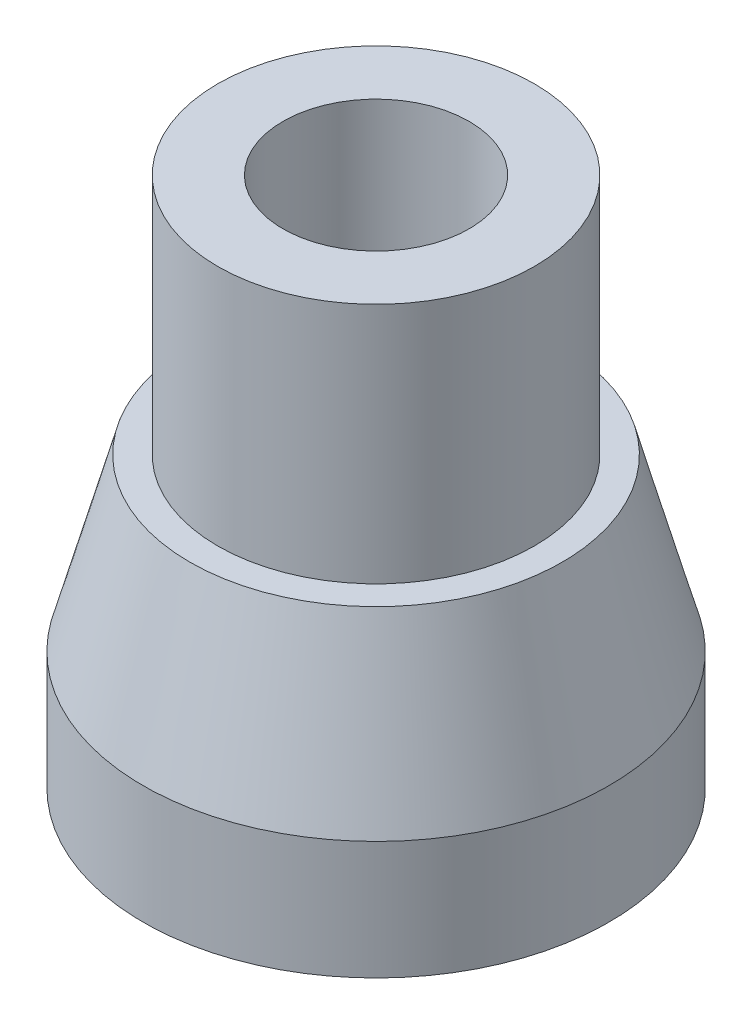
ISO-10303-21;
HEADER;
FILE_DESCRIPTION(('STEP AP214'),'2;1');
FILE_NAME('part.step','',(''),(''),'','','');
FILE_SCHEMA(('AUTOMOTIVE_DESIGN { 1 0 10303 214 1 1 1 1 }'));
ENDSEC;
DATA;
#1=APPLICATION_CONTEXT('core data for automotive mechanical design processes');
#2=APPLICATION_PROTOCOL_DEFINITION('international standard','automotive_design',2000,#1);
#3=PRODUCT_CONTEXT('',#1,'mechanical');
#4=PRODUCT('Part','Part','',(#3));
#5=PRODUCT_RELATED_PRODUCT_CATEGORY('part','',(#4));
#6=PRODUCT_DEFINITION_FORMATION('','',#4);
#7=PRODUCT_DEFINITION_CONTEXT('part definition',#1,'design');
#8=PRODUCT_DEFINITION('design','',#6,#7);
#9=PRODUCT_DEFINITION_SHAPE('','',#8);
#10=(LENGTH_UNIT() NAMED_UNIT(*) SI_UNIT(.MILLI.,.METRE.));
#11=(NAMED_UNIT(*) PLANE_ANGLE_UNIT() SI_UNIT($,.RADIAN.));
#12=(NAMED_UNIT(*) SI_UNIT($,.STERADIAN.) SOLID_ANGLE_UNIT());
#13=UNCERTAINTY_MEASURE_WITH_UNIT(LENGTH_MEASURE(1.E-05),#10,'distance_accuracy_value','');
#14=(GEOMETRIC_REPRESENTATION_CONTEXT(3) GLOBAL_UNCERTAINTY_ASSIGNED_CONTEXT((#13)) GLOBAL_UNIT_ASSIGNED_CONTEXT((#10,
#11,#12)) REPRESENTATION_CONTEXT('',''));
#15=CARTESIAN_POINT('',(0.,0.,0.));
#16=DIRECTION('',(0.,0.,1.));
#17=DIRECTION('',(1.,0.,0.));
#18=AXIS2_PLACEMENT_3D('',#15,#16,#17);
#19=CARTESIAN_POINT('',(0.,0.,0.));
#20=DIRECTION('',(0.,-1.,0.));
#21=DIRECTION('',(0.,0.,-1.));
#22=AXIS2_PLACEMENT_3D('',#19,#20,#21);
#23=CYLINDRICAL_SURFACE('',#22,8.5);
#24=CARTESIAN_POINT('',(0.,28.5,0.));
#25=DIRECTION('',(0.,-1.,0.));
#26=DIRECTION('',(0.,0.,-1.));
#27=AXIS2_PLACEMENT_3D('',#24,#25,#26);
#28=CIRCLE('',#27,8.5);
#29=CARTESIAN_POINT('',(0.,28.5,-8.5));
#30=VERTEX_POINT('',#29);
#31=EDGE_CURVE('E10',#30,#30,#28,.T.);
#32=ORIENTED_EDGE('',*,*,#31,.T.);
#33=EDGE_LOOP('',(#32));
#34=FACE_BOUND('',#33,.T.);
#35=CARTESIAN_POINT('',(0.,15.5,0.));
#36=DIRECTION('',(0.,-1.,0.));
#37=DIRECTION('',(0.,0.,-1.));
#38=AXIS2_PLACEMENT_3D('',#35,#36,#37);
#39=CIRCLE('',#38,8.5);
#40=CARTESIAN_POINT('',(0.,15.5,-8.5));
#41=VERTEX_POINT('',#40);
#42=EDGE_CURVE('E78',#41,#41,#39,.T.);
#43=ORIENTED_EDGE('',*,*,#42,.F.);
#44=EDGE_LOOP('',(#43));
#45=FACE_BOUND('',#44,.T.);
#46=ADVANCED_FACE('F43',(#34,#45),#23,.T.);
#47=CARTESIAN_POINT('',(5.,28.5,0.));
#48=DIRECTION('',(0.,1.,0.));
#49=DIRECTION('',(0.,0.,1.));
#50=AXIS2_PLACEMENT_3D('',#47,#48,#49);
#51=PLANE('',#50);
#52=CARTESIAN_POINT('',(0.,28.5,0.));
#53=DIRECTION('',(0.,-1.,0.));
#54=DIRECTION('',(0.,0.,-1.));
#55=AXIS2_PLACEMENT_3D('',#52,#53,#54);
#56=CIRCLE('',#55,5.);
#57=CARTESIAN_POINT('',(0.,28.5,-5.));
#58=VERTEX_POINT('',#57);
#59=EDGE_CURVE('E50',#58,#58,#56,.T.);
#60=ORIENTED_EDGE('',*,*,#59,.T.);
#61=EDGE_LOOP('',(#60));
#62=FACE_BOUND('',#61,.T.);
#63=ORIENTED_EDGE('',*,*,#31,.F.);
#64=EDGE_LOOP('',(#63));
#65=FACE_BOUND('',#64,.T.);
#66=ADVANCED_FACE('F87',(#62,#65),#51,.T.);
#67=CARTESIAN_POINT('',(0.,0.,0.));
#68=DIRECTION('',(0.,-1.,0.));
#69=DIRECTION('',(0.,0.,-1.));
#70=AXIS2_PLACEMENT_3D('',#67,#68,#69);
#71=CYLINDRICAL_SURFACE('',#70,5.);
#72=CARTESIAN_POINT('',(0.,20.7216932059912,0.));
#73=DIRECTION('',(0.,-1.,0.));
#74=DIRECTION('',(0.,0.,-1.));
#75=AXIS2_PLACEMENT_3D('',#72,#73,#74);
#76=CIRCLE('',#75,5.);
#77=CARTESIAN_POINT('',(0.,20.7216932059912,-5.));
#78=VERTEX_POINT('',#77);
#79=EDGE_CURVE('E55',#78,#78,#76,.T.);
#80=ORIENTED_EDGE('',*,*,#79,.T.);
#81=EDGE_LOOP('',(#80));
#82=FACE_BOUND('',#81,.T.);
#83=ORIENTED_EDGE('',*,*,#59,.F.);
#84=EDGE_LOOP('',(#83));
#85=FACE_BOUND('',#84,.T.);
#86=ADVANCED_FACE('F91',(#82,#85),#71,.F.);
#87=CARTESIAN_POINT('',(0.,20.7216932059912,0.));
#88=DIRECTION('',(0.,-1.,0.));
#89=DIRECTION('',(0.,0.,-1.));
#90=AXIS2_PLACEMENT_3D('',#87,#88,#89);
#91=CONICAL_SURFACE('',#90,5.,0.266714369968657);
#92=CARTESIAN_POINT('',(0.,0.,0.));
#93=DIRECTION('',(0.,-1.,0.));
#94=DIRECTION('',(0.,0.,-1.));
#95=AXIS2_PLACEMENT_3D('',#92,#93,#94);
#96=CIRCLE('',#95,10.6616648103801);
#97=CARTESIAN_POINT('',(0.,0.,-10.6616648103801));
#98=VERTEX_POINT('',#97);
#99=EDGE_CURVE('E60',#98,#98,#96,.T.);
#100=ORIENTED_EDGE('',*,*,#99,.T.);
#101=EDGE_LOOP('',(#100));
#102=FACE_BOUND('',#101,.T.);
#103=ORIENTED_EDGE('',*,*,#79,.F.);
#104=EDGE_LOOP('',(#103));
#105=FACE_BOUND('',#104,.T.);
#106=ADVANCED_FACE('F95',(#102,#105),#91,.F.);
#107=CARTESIAN_POINT('',(12.5,0.,0.));
#108=DIRECTION('',(0.,-1.,0.));
#109=DIRECTION('',(0.,0.,-1.));
#110=AXIS2_PLACEMENT_3D('',#107,#108,#109);
#111=PLANE('',#110);
#112=CARTESIAN_POINT('',(0.,0.,0.));
#113=DIRECTION('',(0.,-1.,0.));
#114=DIRECTION('',(0.,0.,-1.));
#115=AXIS2_PLACEMENT_3D('',#112,#113,#114);
#116=CIRCLE('',#115,12.5);
#117=CARTESIAN_POINT('',(0.,0.,-12.5));
#118=VERTEX_POINT('',#117);
#119=EDGE_CURVE('E66',#118,#118,#116,.T.);
#120=ORIENTED_EDGE('',*,*,#119,.T.);
#121=EDGE_LOOP('',(#120));
#122=FACE_BOUND('',#121,.T.);
#123=ORIENTED_EDGE('',*,*,#99,.F.);
#124=EDGE_LOOP('',(#123));
#125=FACE_BOUND('',#124,.T.);
#126=ADVANCED_FACE('F102',(#122,#125),#111,.T.);
#127=CARTESIAN_POINT('',(0.,0.,0.));
#128=DIRECTION('',(0.,-1.,0.));
#129=DIRECTION('',(0.,0.,-1.));
#130=AXIS2_PLACEMENT_3D('',#127,#128,#129);
#131=CYLINDRICAL_SURFACE('',#130,12.5);
#132=CARTESIAN_POINT('',(0.,6.35,0.));
#133=DIRECTION('',(0.,-1.,0.));
#134=DIRECTION('',(0.,0.,-1.));
#135=AXIS2_PLACEMENT_3D('',#132,#133,#134);
#136=CIRCLE('',#135,12.5);
#137=CARTESIAN_POINT('',(0.,6.35,-12.5));
#138=VERTEX_POINT('',#137);
#139=EDGE_CURVE('E70',#138,#138,#136,.T.);
#140=ORIENTED_EDGE('',*,*,#139,.T.);
#141=EDGE_LOOP('',(#140));
#142=FACE_BOUND('',#141,.T.);
#143=ORIENTED_EDGE('',*,*,#119,.F.);
#144=EDGE_LOOP('',(#143));
#145=FACE_BOUND('',#144,.T.);
#146=ADVANCED_FACE('F106',(#142,#145),#131,.T.);
#147=CARTESIAN_POINT('',(0.,6.35,0.));
#148=DIRECTION('',(0.,-1.,0.));
#149=DIRECTION('',(0.,0.,-1.));
#150=AXIS2_PLACEMENT_3D('',#147,#148,#149);
#151=CONICAL_SURFACE('',#150,12.5,0.266714369968657);
#152=CARTESIAN_POINT('',(0.,15.5,0.));
#153=DIRECTION('',(0.,-1.,0.));
#154=DIRECTION('',(0.,0.,-1.));
#155=AXIS2_PLACEMENT_3D('',#152,#153,#154);
#156=CIRCLE('',#155,10.);
#157=CARTESIAN_POINT('',(0.,15.5,-10.));
#158=VERTEX_POINT('',#157);
#159=EDGE_CURVE('E74',#158,#158,#156,.T.);
#160=ORIENTED_EDGE('',*,*,#159,.T.);
#161=EDGE_LOOP('',(#160));
#162=FACE_BOUND('',#161,.T.);
#163=ORIENTED_EDGE('',*,*,#139,.F.);
#164=EDGE_LOOP('',(#163));
#165=FACE_BOUND('',#164,.T.);
#166=ADVANCED_FACE('F110',(#162,#165),#151,.T.);
#167=CARTESIAN_POINT('',(8.5,15.5,0.));
#168=DIRECTION('',(0.,1.,0.));
#169=DIRECTION('',(0.,0.,1.));
#170=AXIS2_PLACEMENT_3D('',#167,#168,#169);
#171=PLANE('',#170);
#172=ORIENTED_EDGE('',*,*,#42,.T.);
#173=EDGE_LOOP('',(#172));
#174=FACE_BOUND('',#173,.T.);
#175=ORIENTED_EDGE('',*,*,#159,.F.);
#176=EDGE_LOOP('',(#175));
#177=FACE_BOUND('',#176,.T.);
#178=ADVANCED_FACE('F83',(#174,#177),#171,.T.);
#179=CLOSED_SHELL('',(#46,#66,#86,#106,#126,#146,#166,#178));
#180=MANIFOLD_SOLID_BREP('B2',#179);
#181=ADVANCED_BREP_SHAPE_REPRESENTATION('',(#18,#180),#14);
#182=SHAPE_DEFINITION_REPRESENTATION(#9,#181);
ENDSEC;
END-ISO-10303-21;
